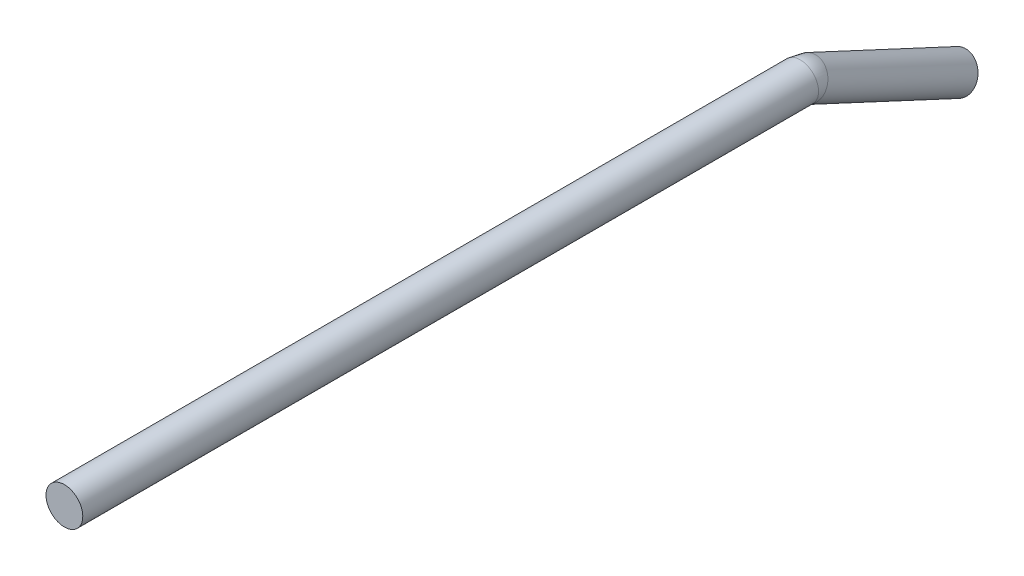
ISO-10303-21;
HEADER;
FILE_DESCRIPTION(('STEP AP214'),'2;1');
FILE_NAME('part.step','',(''),(''),'','','');
FILE_SCHEMA(('AUTOMOTIVE_DESIGN { 1 0 10303 214 1 1 1 1 }'));
ENDSEC;
DATA;
#1=APPLICATION_CONTEXT('core data for automotive mechanical design processes');
#2=APPLICATION_PROTOCOL_DEFINITION('international standard','automotive_design',2000,#1);
#3=PRODUCT_CONTEXT('',#1,'mechanical');
#4=PRODUCT('Part','Part','',(#3));
#5=PRODUCT_RELATED_PRODUCT_CATEGORY('part','',(#4));
#6=PRODUCT_DEFINITION_FORMATION('','',#4);
#7=PRODUCT_DEFINITION_CONTEXT('part definition',#1,'design');
#8=PRODUCT_DEFINITION('design','',#6,#7);
#9=PRODUCT_DEFINITION_SHAPE('','',#8);
#10=(LENGTH_UNIT() NAMED_UNIT(*) SI_UNIT(.MILLI.,.METRE.));
#11=(NAMED_UNIT(*) PLANE_ANGLE_UNIT() SI_UNIT($,.RADIAN.));
#12=(NAMED_UNIT(*) SI_UNIT($,.STERADIAN.) SOLID_ANGLE_UNIT());
#13=UNCERTAINTY_MEASURE_WITH_UNIT(LENGTH_MEASURE(1.E-05),#10,'distance_accuracy_value','');
#14=(GEOMETRIC_REPRESENTATION_CONTEXT(3) GLOBAL_UNCERTAINTY_ASSIGNED_CONTEXT((#13)) GLOBAL_UNIT_ASSIGNED_CONTEXT((#10,
#11,#12)) REPRESENTATION_CONTEXT('',''));
#15=CARTESIAN_POINT('',(0.,0.,0.));
#16=DIRECTION('',(0.,0.,1.));
#17=DIRECTION('',(1.,0.,0.));
#18=AXIS2_PLACEMENT_3D('',#15,#16,#17);
#19=CARTESIAN_POINT('',(0.,-38.8971993487338,-83.6069581784143));
#20=DIRECTION('',(0.,0.421822063303628,0.90667863485927));
#21=DIRECTION('',(0.,-0.90667863485927,0.421822063303628));
#22=AXIS2_PLACEMENT_3D('',#19,#20,#21);
#23=PLANE('',#22);
#24=CARTESIAN_POINT('',(0.,-38.8971993487338,-83.6069581784143));
#25=DIRECTION('',(0.,0.421822063303628,0.90667863485927));
#26=DIRECTION('',(0.,-0.90667863485927,0.421822063303628));
#27=AXIS2_PLACEMENT_3D('',#24,#25,#26);
#28=CIRCLE('',#27,10.);
#29=CARTESIAN_POINT('',(0.,-47.9639856973265,-79.3887375453781));
#30=VERTEX_POINT('',#29);
#31=EDGE_CURVE('E64',#30,#30,#28,.T.);
#32=ORIENTED_EDGE('',*,*,#31,.F.);
#33=EDGE_LOOP('',(#32));
#34=FACE_BOUND('',#33,.T.);
#35=ADVANCED_FACE('F48',(#34),#23,.F.);
#36=CARTESIAN_POINT('',(0.,0.,402.212339591956));
#37=DIRECTION('',(0.,0.,1.));
#38=DIRECTION('',(0.,-1.,0.));
#39=AXIS2_PLACEMENT_3D('',#36,#37,#38);
#40=PLANE('',#39);
#41=CARTESIAN_POINT('',(0.,0.,402.212339591956));
#42=DIRECTION('',(0.,0.,1.));
#43=DIRECTION('',(0.,-1.,0.));
#44=AXIS2_PLACEMENT_3D('',#41,#42,#43);
#45=CIRCLE('',#44,10.);
#46=CARTESIAN_POINT('',(0.,-10.,402.212339591956));
#47=VERTEX_POINT('',#46);
#48=EDGE_CURVE('E12',#47,#47,#45,.T.);
#49=ORIENTED_EDGE('',*,*,#48,.T.);
#50=EDGE_LOOP('',(#49));
#51=FACE_BOUND('',#50,.T.);
#52=ADVANCED_FACE('F71',(#51),#40,.T.);
#53=CARTESIAN_POINT('',(0.,-38.8971993487338,-83.6069581784143));
#54=DIRECTION('',(0.,0.421822063303628,0.90667863485927));
#55=DIRECTION('',(0.,-0.90667863485927,0.421822063303628));
#56=AXIS2_PLACEMENT_3D('',#53,#54,#55);
#57=CYLINDRICAL_SURFACE('',#56,10.);
#58=CARTESIAN_POINT('',(0.,-0.933213651407319,-2.0058810410801));
#59=DIRECTION('',(0.,0.421822063303628,0.90667863485927));
#60=DIRECTION('',(0.,-0.90667863485927,0.421822063303628));
#61=AXIS2_PLACEMENT_3D('',#58,#59,#60);
#62=CIRCLE('',#61,10.);
#63=CARTESIAN_POINT('',(0.,-10.,2.21233959195626));
#64=VERTEX_POINT('',#63);
#65=EDGE_CURVE('E58',#64,#64,#62,.T.);
#66=ORIENTED_EDGE('',*,*,#65,.F.);
#67=EDGE_LOOP('',(#66));
#68=FACE_BOUND('',#67,.T.);
#69=ORIENTED_EDGE('',*,*,#31,.T.);
#70=EDGE_LOOP('',(#69));
#71=FACE_BOUND('',#70,.T.);
#72=ADVANCED_FACE('F59',(#68,#71),#57,.T.);
#73=CARTESIAN_POINT('',(0.,-10.,2.21233959195626));
#74=DIRECTION('',(1.,0.,0.));
#75=DIRECTION('',(0.,0.,-1.));
#76=AXIS2_PLACEMENT_3D('',#73,#74,#75);
#77=TOROIDAL_SURFACE('',#76,10.0000000000004,10.);
#78=CARTESIAN_POINT('',(0.,0.,2.21233959195626));
#79=DIRECTION('',(0.,0.,1.));
#80=DIRECTION('',(0.,-1.,0.));
#81=AXIS2_PLACEMENT_3D('',#78,#79,#80);
#82=CIRCLE('',#81,10.);
#83=EDGE_CURVE('E54',#64,#64,#82,.T.);
#84=ORIENTED_EDGE('',*,*,#83,.F.);
#85=ORIENTED_EDGE('',*,*,#65,.T.);
#86=EDGE_LOOP('',(#84,#85));
#87=FACE_BOUND('',#86,.T.);
#88=ADVANCED_FACE('F78',(#87),#77,.T.);
#89=CARTESIAN_POINT('',(0.,0.,2.21233959195624));
#90=DIRECTION('',(0.,0.,1.));
#91=DIRECTION('',(0.,-1.,0.));
#92=AXIS2_PLACEMENT_3D('',#89,#90,#91);
#93=CYLINDRICAL_SURFACE('',#92,10.);
#94=ORIENTED_EDGE('',*,*,#48,.F.);
#95=EDGE_LOOP('',(#94));
#96=FACE_BOUND('',#95,.T.);
#97=ORIENTED_EDGE('',*,*,#83,.T.);
#98=EDGE_LOOP('',(#97));
#99=FACE_BOUND('',#98,.T.);
#100=ADVANCED_FACE('F76',(#96,#99),#93,.T.);
#101=CLOSED_SHELL('',(#35,#52,#72,#88,#100));
#102=MANIFOLD_SOLID_BREP('B2',#101);
#103=ADVANCED_BREP_SHAPE_REPRESENTATION('',(#18,#102),#14);
#104=SHAPE_DEFINITION_REPRESENTATION(#9,#103);
ENDSEC;
END-ISO-10303-21;
